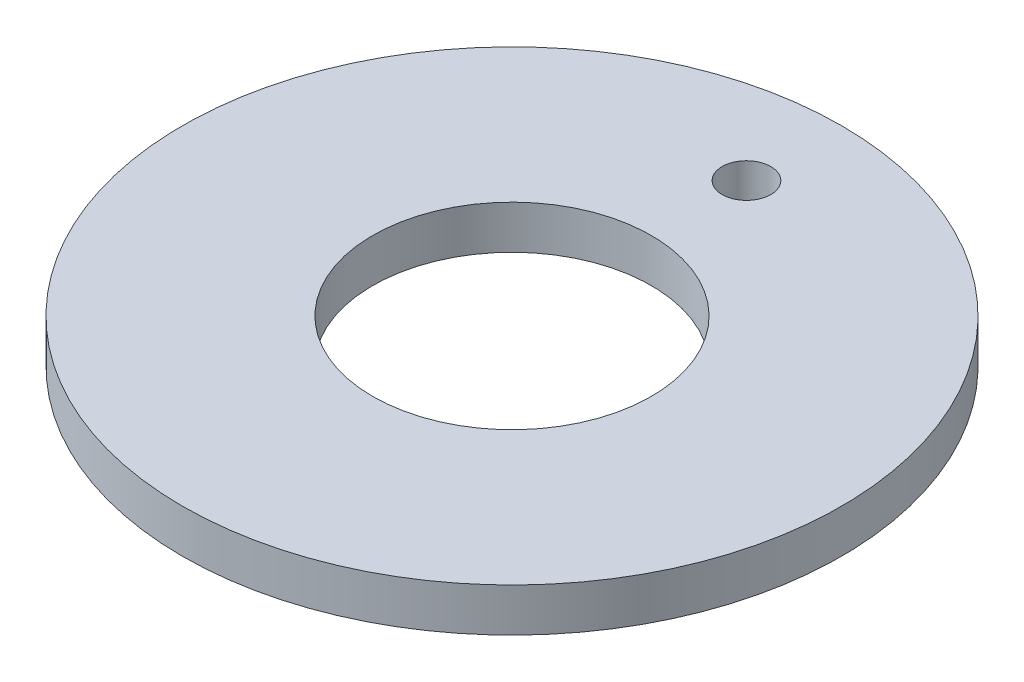
ISO-10303-21;
HEADER;
FILE_DESCRIPTION(('STEP AP214'),'2;1');
FILE_NAME('part.step','',(''),(''),'','','');
FILE_SCHEMA(('AUTOMOTIVE_DESIGN { 1 0 10303 214 1 1 1 1 }'));
ENDSEC;
DATA;
#1=APPLICATION_CONTEXT('core data for automotive mechanical design processes');
#2=APPLICATION_PROTOCOL_DEFINITION('international standard','automotive_design',2000,#1);
#3=PRODUCT_CONTEXT('',#1,'mechanical');
#4=PRODUCT('Part','Part','',(#3));
#5=PRODUCT_RELATED_PRODUCT_CATEGORY('part','',(#4));
#6=PRODUCT_DEFINITION_FORMATION('','',#4);
#7=PRODUCT_DEFINITION_CONTEXT('part definition',#1,'design');
#8=PRODUCT_DEFINITION('design','',#6,#7);
#9=PRODUCT_DEFINITION_SHAPE('','',#8);
#10=(LENGTH_UNIT() NAMED_UNIT(*) SI_UNIT(.MILLI.,.METRE.));
#11=(NAMED_UNIT(*) PLANE_ANGLE_UNIT() SI_UNIT($,.RADIAN.));
#12=(NAMED_UNIT(*) SI_UNIT($,.STERADIAN.) SOLID_ANGLE_UNIT());
#13=UNCERTAINTY_MEASURE_WITH_UNIT(LENGTH_MEASURE(1.E-05),#10,'distance_accuracy_value','');
#14=(GEOMETRIC_REPRESENTATION_CONTEXT(3) GLOBAL_UNCERTAINTY_ASSIGNED_CONTEXT((#13)) GLOBAL_UNIT_ASSIGNED_CONTEXT((#10,
#11,#12)) REPRESENTATION_CONTEXT('',''));
#15=CARTESIAN_POINT('',(0.,0.,0.));
#16=DIRECTION('',(0.,0.,1.));
#17=DIRECTION('',(1.,0.,0.));
#18=AXIS2_PLACEMENT_3D('',#15,#16,#17);
#19=CARTESIAN_POINT('',(0.,5.,0.));
#20=DIRECTION('',(0.,1.,0.));
#21=DIRECTION('',(0.,0.,1.));
#22=AXIS2_PLACEMENT_3D('',#19,#20,#21);
#23=PLANE('',#22);
#24=CARTESIAN_POINT('',(0.,5.,0.));
#25=DIRECTION('',(0.,1.,0.));
#26=DIRECTION('',(0.,0.,1.));
#27=AXIS2_PLACEMENT_3D('',#24,#25,#26);
#28=CIRCLE('',#27,16.05);
#29=CARTESIAN_POINT('',(0.,5.,16.05));
#30=VERTEX_POINT('',#29);
#31=EDGE_CURVE('E62',#30,#30,#28,.T.);
#32=ORIENTED_EDGE('',*,*,#31,.F.);
#33=EDGE_LOOP('',(#32));
#34=FACE_BOUND('',#33,.T.);
#35=CARTESIAN_POINT('',(0.,5.,0.));
#36=DIRECTION('',(0.,1.,0.));
#37=DIRECTION('',(0.,0.,1.));
#38=AXIS2_PLACEMENT_3D('',#35,#36,#37);
#39=CIRCLE('',#38,37.95);
#40=CARTESIAN_POINT('',(0.,5.,37.9500000000001));
#41=VERTEX_POINT('',#40);
#42=EDGE_CURVE('E12',#41,#41,#39,.T.);
#43=ORIENTED_EDGE('',*,*,#42,.T.);
#44=EDGE_LOOP('',(#43));
#45=FACE_BOUND('',#44,.T.);
#46=CARTESIAN_POINT('',(0.,5.,-27.0000000000001));
#47=DIRECTION('',(0.,1.,0.));
#48=DIRECTION('',(0.,0.,1.));
#49=AXIS2_PLACEMENT_3D('',#46,#47,#48);
#50=CIRCLE('',#49,2.8);
#51=CARTESIAN_POINT('',(0.,5.,-24.2000000000001));
#52=VERTEX_POINT('',#51);
#53=EDGE_CURVE('E68',#52,#52,#50,.T.);
#54=ORIENTED_EDGE('',*,*,#53,.F.);
#55=EDGE_LOOP('',(#54));
#56=FACE_BOUND('',#55,.T.);
#57=ADVANCED_FACE('F48',(#34,#45,#56),#23,.T.);
#58=CARTESIAN_POINT('',(0.,0.,0.));
#59=DIRECTION('',(0.,1.,0.));
#60=DIRECTION('',(0.,0.,1.));
#61=AXIS2_PLACEMENT_3D('',#58,#59,#60);
#62=PLANE('',#61);
#63=CARTESIAN_POINT('',(0.,0.,0.));
#64=DIRECTION('',(0.,1.,0.));
#65=DIRECTION('',(0.,0.,1.));
#66=AXIS2_PLACEMENT_3D('',#63,#64,#65);
#67=CIRCLE('',#66,37.95);
#68=CARTESIAN_POINT('',(0.,0.,37.9500000000001));
#69=VERTEX_POINT('',#68);
#70=EDGE_CURVE('E52',#69,#69,#67,.T.);
#71=ORIENTED_EDGE('',*,*,#70,.F.);
#72=EDGE_LOOP('',(#71));
#73=FACE_BOUND('',#72,.T.);
#74=CARTESIAN_POINT('',(0.,0.,0.));
#75=DIRECTION('',(0.,1.,0.));
#76=DIRECTION('',(0.,0.,1.));
#77=AXIS2_PLACEMENT_3D('',#74,#75,#76);
#78=CIRCLE('',#77,16.05);
#79=CARTESIAN_POINT('',(0.,0.,16.05));
#80=VERTEX_POINT('',#79);
#81=EDGE_CURVE('E64',#80,#80,#78,.T.);
#82=ORIENTED_EDGE('',*,*,#81,.T.);
#83=EDGE_LOOP('',(#82));
#84=FACE_BOUND('',#83,.T.);
#85=CARTESIAN_POINT('',(0.,0.,-27.0000000000001));
#86=DIRECTION('',(0.,1.,0.));
#87=DIRECTION('',(0.,0.,1.));
#88=AXIS2_PLACEMENT_3D('',#85,#86,#87);
#89=CIRCLE('',#88,2.8);
#90=CARTESIAN_POINT('',(0.,0.,-24.2000000000001));
#91=VERTEX_POINT('',#90);
#92=EDGE_CURVE('E72',#91,#91,#89,.T.);
#93=ORIENTED_EDGE('',*,*,#92,.T.);
#94=EDGE_LOOP('',(#93));
#95=FACE_BOUND('',#94,.T.);
#96=ADVANCED_FACE('F85',(#73,#84,#95),#62,.F.);
#97=CARTESIAN_POINT('',(0.,5.,0.));
#98=DIRECTION('',(0.,-1.,0.));
#99=DIRECTION('',(0.,0.,-1.));
#100=AXIS2_PLACEMENT_3D('',#97,#98,#99);
#101=CYLINDRICAL_SURFACE('',#100,37.95);
#102=ORIENTED_EDGE('',*,*,#42,.F.);
#103=EDGE_LOOP('',(#102));
#104=FACE_BOUND('',#103,.T.);
#105=ORIENTED_EDGE('',*,*,#70,.T.);
#106=EDGE_LOOP('',(#105));
#107=FACE_BOUND('',#106,.T.);
#108=ADVANCED_FACE('F50',(#104,#107),#101,.T.);
#109=CARTESIAN_POINT('',(0.,5.,0.));
#110=DIRECTION('',(0.,-1.,0.));
#111=DIRECTION('',(0.,0.,-1.));
#112=AXIS2_PLACEMENT_3D('',#109,#110,#111);
#113=CYLINDRICAL_SURFACE('',#112,16.05);
#114=ORIENTED_EDGE('',*,*,#31,.T.);
#115=EDGE_LOOP('',(#114));
#116=FACE_BOUND('',#115,.T.);
#117=ORIENTED_EDGE('',*,*,#81,.F.);
#118=EDGE_LOOP('',(#117));
#119=FACE_BOUND('',#118,.T.);
#120=ADVANCED_FACE('F94',(#116,#119),#113,.F.);
#121=CARTESIAN_POINT('',(0.,5.,-27.0000000000001));
#122=DIRECTION('',(0.,-1.,0.));
#123=DIRECTION('',(0.,0.,-1.));
#124=AXIS2_PLACEMENT_3D('',#121,#122,#123);
#125=CYLINDRICAL_SURFACE('',#124,2.8);
#126=ORIENTED_EDGE('',*,*,#53,.T.);
#127=EDGE_LOOP('',(#126));
#128=FACE_BOUND('',#127,.T.);
#129=ORIENTED_EDGE('',*,*,#92,.F.);
#130=EDGE_LOOP('',(#129));
#131=FACE_BOUND('',#130,.T.);
#132=ADVANCED_FACE('F81',(#128,#131),#125,.F.);
#133=CLOSED_SHELL('',(#57,#96,#108,#120,#132));
#134=MANIFOLD_SOLID_BREP('B2',#133);
#135=ADVANCED_BREP_SHAPE_REPRESENTATION('',(#18,#134),#14);
#136=SHAPE_DEFINITION_REPRESENTATION(#9,#135);
ENDSEC;
END-ISO-10303-21;
